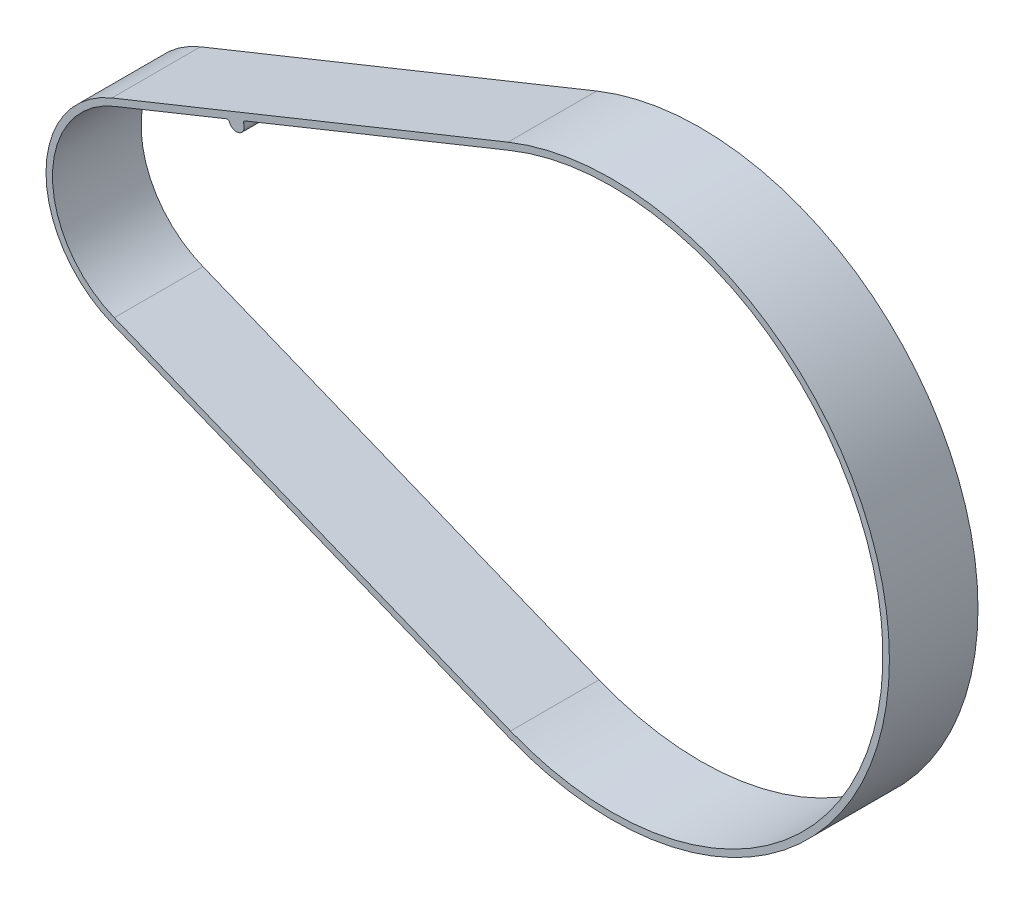
ISO-10303-21;
HEADER;
FILE_DESCRIPTION(('STEP AP214'),'2;1');
FILE_NAME('part.step','',(''),(''),'','','');
FILE_SCHEMA(('AUTOMOTIVE_DESIGN { 1 0 10303 214 1 1 1 1 }'));
ENDSEC;
DATA;
#1=APPLICATION_CONTEXT('core data for automotive mechanical design processes');
#2=APPLICATION_PROTOCOL_DEFINITION('international standard','automotive_design',2000,#1);
#3=PRODUCT_CONTEXT('',#1,'mechanical');
#4=PRODUCT('Part','Part','',(#3));
#5=PRODUCT_RELATED_PRODUCT_CATEGORY('part','',(#4));
#6=PRODUCT_DEFINITION_FORMATION('','',#4);
#7=PRODUCT_DEFINITION_CONTEXT('part definition',#1,'design');
#8=PRODUCT_DEFINITION('design','',#6,#7);
#9=PRODUCT_DEFINITION_SHAPE('','',#8);
#10=(LENGTH_UNIT() NAMED_UNIT(*) SI_UNIT(.MILLI.,.METRE.));
#11=(NAMED_UNIT(*) PLANE_ANGLE_UNIT() SI_UNIT($,.RADIAN.));
#12=(NAMED_UNIT(*) SI_UNIT($,.STERADIAN.) SOLID_ANGLE_UNIT());
#13=UNCERTAINTY_MEASURE_WITH_UNIT(LENGTH_MEASURE(1.E-05),#10,'distance_accuracy_value','');
#14=(GEOMETRIC_REPRESENTATION_CONTEXT(3) GLOBAL_UNCERTAINTY_ASSIGNED_CONTEXT((#13)) GLOBAL_UNIT_ASSIGNED_CONTEXT((#10,
#11,#12)) REPRESENTATION_CONTEXT('',''));
#15=CARTESIAN_POINT('',(0.,0.,0.));
#16=DIRECTION('',(0.,0.,1.));
#17=DIRECTION('',(1.,0.,0.));
#18=AXIS2_PLACEMENT_3D('',#15,#16,#17);
#19=CARTESIAN_POINT('',(-12.5059702381417,31.0012171742421,15.));
#20=DIRECTION('',(-0.374109321887665,0.927384610222076,0.));
#21=DIRECTION('',(-0.927384610222076,-0.374109321887665,0.));
#22=AXIS2_PLACEMENT_3D('',#19,#20,#21);
#23=PLANE('',#22);
#24=DIRECTION('',(0.927384610222076,0.374109321887665,0.));
#25=VECTOR('',#24,1.);
#26=CARTESIAN_POINT('',(-12.5059702381417,31.0012171742421,-15.));
#27=LINE('',#26,#25);
#28=CARTESIAN_POINT('',(-12.5059702381417,31.0012171742421,-15.));
#29=VERTEX_POINT('',#28);
#30=CARTESIAN_POINT('',(25.4411738449035,46.3091920791546,-15.));
#31=VERTEX_POINT('',#30);
#32=EDGE_CURVE('E182',#29,#31,#27,.T.);
#33=ORIENTED_EDGE('',*,*,#32,.T.);
#34=DIRECTION('',(0.,0.,1.));
#35=VECTOR('',#34,1.);
#36=CARTESIAN_POINT('',(25.4411738449035,46.3091920791546,15.));
#37=LINE('',#36,#35);
#38=CARTESIAN_POINT('',(25.4411738449035,46.3091920791546,15.));
#39=VERTEX_POINT('',#38);
#40=EDGE_CURVE('E60',#31,#39,#37,.T.);
#41=ORIENTED_EDGE('',*,*,#40,.T.);
#42=DIRECTION('',(0.927384610222076,0.374109321887665,0.));
#43=VECTOR('',#42,1.);
#44=CARTESIAN_POINT('',(-12.5059702381417,31.0012171742421,15.));
#45=LINE('',#44,#43);
#46=CARTESIAN_POINT('',(-12.5059702381417,31.0012171742421,15.));
#47=VERTEX_POINT('',#46);
#48=EDGE_CURVE('E160',#47,#39,#45,.T.);
#49=ORIENTED_EDGE('',*,*,#48,.F.);
#50=DIRECTION('',(0.,0.,-1.));
#51=VECTOR('',#50,1.);
#52=CARTESIAN_POINT('',(-12.5059702381417,31.0012171742421,15.));
#53=LINE('',#52,#51);
#54=EDGE_CURVE('E206',#47,#29,#53,.T.);
#55=ORIENTED_EDGE('',*,*,#54,.T.);
#56=EDGE_LOOP('',(#33,#41,#49,#55));
#57=FACE_BOUND('',#56,.T.);
#58=ADVANCED_FACE('F39',(#57),#23,.F.);
#59=CARTESIAN_POINT('',(31.7473891944136,48.8531354679907,15.));
#60=VERTEX_POINT('',#59);
#61=CARTESIAN_POINT('',(121.660615345031,85.1243606890831,15.));
#62=VERTEX_POINT('',#61);
#63=EDGE_CURVE('E150',#60,#62,#45,.T.);
#64=ORIENTED_EDGE('',*,*,#63,.F.);
#65=DIRECTION('',(0.,0.,1.));
#66=VECTOR('',#65,1.);
#67=CARTESIAN_POINT('',(31.7473891944136,48.8531354679907,-15.));
#68=LINE('',#67,#66);
#69=CARTESIAN_POINT('',(31.7473891944136,48.8531354679907,-15.));
#70=VERTEX_POINT('',#69);
#71=EDGE_CURVE('E204',#60,#70,#68,.F.);
#72=ORIENTED_EDGE('',*,*,#71,.T.);
#73=CARTESIAN_POINT('',(121.660615345031,85.1243606890831,-15.));
#74=VERTEX_POINT('',#73);
#75=EDGE_CURVE('E181',#70,#74,#27,.T.);
#76=ORIENTED_EDGE('',*,*,#75,.T.);
#77=DIRECTION('',(0.,0.,-1.));
#78=VECTOR('',#77,1.);
#79=CARTESIAN_POINT('',(121.660615345031,85.1243606890831,15.));
#80=LINE('',#79,#78);
#81=EDGE_CURVE('E173',#62,#74,#80,.T.);
#82=ORIENTED_EDGE('',*,*,#81,.F.);
#83=EDGE_LOOP('',(#64,#72,#76,#82));
#84=FACE_BOUND('',#83,.T.);
#85=ADVANCED_FACE('F227',(#84),#23,.F.);
#86=CARTESIAN_POINT('',(-13.3290107462946,33.0414633167307,15.));
#87=DIRECTION('',(-0.374109321887665,0.927384610222076,0.));
#88=DIRECTION('',(-0.927384610222076,-0.374109321887665,0.));
#89=AXIS2_PLACEMENT_3D('',#86,#87,#88);
#90=PLANE('',#89);
#91=DIRECTION('',(0.927384610222076,0.374109321887665,0.));
#92=VECTOR('',#91,1.);
#93=CARTESIAN_POINT('',(-13.3290107462946,33.0414633167307,-15.));
#94=LINE('',#93,#92);
#95=CARTESIAN_POINT('',(-13.3290107462946,33.0414633167307,-15.));
#96=VERTEX_POINT('',#95);
#97=CARTESIAN_POINT('',(120.837574836879,87.1646068315717,-15.));
#98=VERTEX_POINT('',#97);
#99=EDGE_CURVE('E184',#96,#98,#94,.T.);
#100=ORIENTED_EDGE('',*,*,#99,.F.);
#101=DIRECTION('',(0.,0.,-1.));
#102=VECTOR('',#101,1.);
#103=CARTESIAN_POINT('',(-13.3290107462946,33.0414633167307,15.));
#104=LINE('',#103,#102);
#105=CARTESIAN_POINT('',(-13.3290107462946,33.0414633167307,15.));
#106=VERTEX_POINT('',#105);
#107=EDGE_CURVE('E202',#106,#96,#104,.T.);
#108=ORIENTED_EDGE('',*,*,#107,.F.);
#109=DIRECTION('',(0.927384610222076,0.374109321887665,0.));
#110=VECTOR('',#109,1.);
#111=CARTESIAN_POINT('',(-13.3290107462946,33.0414633167307,15.));
#112=LINE('',#111,#110);
#113=CARTESIAN_POINT('',(120.837574836879,87.1646068315717,15.));
#114=VERTEX_POINT('',#113);
#115=EDGE_CURVE('E162',#106,#114,#112,.T.);
#116=ORIENTED_EDGE('',*,*,#115,.T.);
#117=DIRECTION('',(0.,0.,-1.));
#118=VECTOR('',#117,1.);
#119=CARTESIAN_POINT('',(120.837574836879,87.1646068315717,15.));
#120=LINE('',#119,#118);
#121=EDGE_CURVE('E139',#114,#98,#120,.T.);
#122=ORIENTED_EDGE('',*,*,#121,.T.);
#123=EDGE_LOOP('',(#100,#108,#116,#122));
#124=FACE_BOUND('',#123,.T.);
#125=ADVANCED_FACE('F258',(#124),#90,.T.);
#126=CARTESIAN_POINT('',(0.,0.,15.));
#127=DIRECTION('',(0.,0.,-1.));
#128=DIRECTION('',(-1.,0.,0.));
#129=AXIS2_PLACEMENT_3D('',#126,#127,#128);
#130=CYLINDRICAL_SURFACE('',#129,35.628651750883);
#131=CARTESIAN_POINT('',(0.,0.,-15.));
#132=DIRECTION('',(0.,0.,1.));
#133=DIRECTION('',(1.,0.,0.));
#134=AXIS2_PLACEMENT_3D('',#131,#132,#133);
#135=CIRCLE('',#134,35.628651750883);
#136=CARTESIAN_POINT('',(-13.3290107462946,-33.0414633167307,-15.));
#137=VERTEX_POINT('',#136);
#138=EDGE_CURVE('E187',#96,#137,#135,.T.);
#139=ORIENTED_EDGE('',*,*,#138,.T.);
#140=DIRECTION('',(0.,0.,-1.));
#141=VECTOR('',#140,1.);
#142=CARTESIAN_POINT('',(-13.3290107462946,-33.0414633167307,15.));
#143=LINE('',#142,#141);
#144=CARTESIAN_POINT('',(-13.3290107462946,-33.0414633167307,15.));
#145=VERTEX_POINT('',#144);
#146=EDGE_CURVE('E199',#145,#137,#143,.T.);
#147=ORIENTED_EDGE('',*,*,#146,.F.);
#148=CARTESIAN_POINT('',(0.,0.,15.));
#149=DIRECTION('',(0.,0.,1.));
#150=DIRECTION('',(1.,0.,0.));
#151=AXIS2_PLACEMENT_3D('',#148,#149,#150);
#152=CIRCLE('',#151,35.628651750883);
#153=EDGE_CURVE('E165',#106,#145,#152,.T.);
#154=ORIENTED_EDGE('',*,*,#153,.F.);
#155=ORIENTED_EDGE('',*,*,#107,.T.);
#156=EDGE_LOOP('',(#139,#147,#154,#155));
#157=FACE_BOUND('',#156,.T.);
#158=ADVANCED_FACE('F262',(#157),#130,.T.);
#159=CARTESIAN_POINT('',(-13.3290107462946,-33.0414633167307,15.));
#160=DIRECTION('',(0.374109321887665,0.927384610222076,0.));
#161=DIRECTION('',(-0.927384610222076,0.374109321887665,0.));
#162=AXIS2_PLACEMENT_3D('',#159,#160,#161);
#163=PLANE('',#162);
#164=DIRECTION('',(0.927384610222076,-0.374109321887665,0.));
#165=VECTOR('',#164,1.);
#166=CARTESIAN_POINT('',(-13.3290107462946,-33.0414633167307,-15.));
#167=LINE('',#166,#165);
#168=CARTESIAN_POINT('',(120.837574836879,-87.1646068315717,-15.));
#169=VERTEX_POINT('',#168);
#170=EDGE_CURVE('E190',#137,#169,#167,.T.);
#171=ORIENTED_EDGE('',*,*,#170,.T.);
#172=DIRECTION('',(0.,0.,-1.));
#173=VECTOR('',#172,1.);
#174=CARTESIAN_POINT('',(120.837574836879,-87.1646068315717,15.));
#175=LINE('',#174,#173);
#176=CARTESIAN_POINT('',(120.837574836879,-87.1646068315717,15.));
#177=VERTEX_POINT('',#176);
#178=EDGE_CURVE('E196',#177,#169,#175,.T.);
#179=ORIENTED_EDGE('',*,*,#178,.F.);
#180=DIRECTION('',(0.927384610222076,-0.374109321887665,0.));
#181=VECTOR('',#180,1.);
#182=CARTESIAN_POINT('',(-13.3290107462946,-33.0414633167307,15.));
#183=LINE('',#182,#181);
#184=EDGE_CURVE('E168',#145,#177,#183,.T.);
#185=ORIENTED_EDGE('',*,*,#184,.F.);
#186=ORIENTED_EDGE('',*,*,#146,.T.);
#187=EDGE_LOOP('',(#171,#179,#185,#186));
#188=FACE_BOUND('',#187,.T.);
#189=ADVANCED_FACE('F266',(#188),#163,.F.);
#190=CARTESIAN_POINT('',(156.,0.,15.));
#191=DIRECTION('',(0.,0.,-1.));
#192=DIRECTION('',(-1.,0.,0.));
#193=AXIS2_PLACEMENT_3D('',#190,#191,#192);
#194=CYLINDRICAL_SURFACE('',#193,91.7897059653587);
#195=CARTESIAN_POINT('',(156.,0.,-15.));
#196=DIRECTION('',(0.,0.,1.));
#197=DIRECTION('',(1.,0.,0.));
#198=AXIS2_PLACEMENT_3D('',#195,#196,#197);
#199=CIRCLE('',#198,91.7897059653587);
#200=CARTESIAN_POINT('',(121.660615345031,-85.1243606890832,-15.));
#201=VERTEX_POINT('',#200);
#202=EDGE_CURVE('E134',#201,#74,#199,.T.);
#203=ORIENTED_EDGE('',*,*,#202,.F.);
#204=DIRECTION('',(0.,0.,-1.));
#205=VECTOR('',#204,1.);
#206=CARTESIAN_POINT('',(121.660615345031,-85.1243606890832,15.));
#207=LINE('',#206,#205);
#208=CARTESIAN_POINT('',(121.660615345031,-85.1243606890832,15.));
#209=VERTEX_POINT('',#208);
#210=EDGE_CURVE('E128',#209,#201,#207,.T.);
#211=ORIENTED_EDGE('',*,*,#210,.F.);
#212=CARTESIAN_POINT('',(156.,0.,15.));
#213=DIRECTION('',(0.,0.,1.));
#214=DIRECTION('',(1.,0.,0.));
#215=AXIS2_PLACEMENT_3D('',#212,#213,#214);
#216=CIRCLE('',#215,91.7897059653587);
#217=EDGE_CURVE('E132',#209,#62,#216,.T.);
#218=ORIENTED_EDGE('',*,*,#217,.T.);
#219=ORIENTED_EDGE('',*,*,#81,.T.);
#220=EDGE_LOOP('',(#203,#211,#218,#219));
#221=FACE_BOUND('',#220,.T.);
#222=ADVANCED_FACE('F130',(#221),#194,.F.);
#223=CARTESIAN_POINT('',(-12.5059702381417,-31.0012171742421,15.));
#224=DIRECTION('',(0.374109321887665,0.927384610222076,0.));
#225=DIRECTION('',(-0.927384610222076,0.374109321887665,0.));
#226=AXIS2_PLACEMENT_3D('',#223,#224,#225);
#227=PLANE('',#226);
#228=DIRECTION('',(0.927384610222076,-0.374109321887665,0.));
#229=VECTOR('',#228,1.);
#230=CARTESIAN_POINT('',(-12.5059702381417,-31.0012171742421,-15.));
#231=LINE('',#230,#229);
#232=CARTESIAN_POINT('',(-12.5059702381417,-31.0012171742421,-15.));
#233=VERTEX_POINT('',#232);
#234=EDGE_CURVE('E175',#233,#201,#231,.T.);
#235=ORIENTED_EDGE('',*,*,#234,.F.);
#236=DIRECTION('',(0.,0.,-1.));
#237=VECTOR('',#236,1.);
#238=CARTESIAN_POINT('',(-12.5059702381417,-31.0012171742421,15.));
#239=LINE('',#238,#237);
#240=CARTESIAN_POINT('',(-12.5059702381417,-31.0012171742421,15.));
#241=VERTEX_POINT('',#240);
#242=EDGE_CURVE('E140',#241,#233,#239,.T.);
#243=ORIENTED_EDGE('',*,*,#242,.F.);
#244=DIRECTION('',(0.927384610222076,-0.374109321887665,0.));
#245=VECTOR('',#244,1.);
#246=CARTESIAN_POINT('',(-12.5059702381417,-31.0012171742421,15.));
#247=LINE('',#246,#245);
#248=EDGE_CURVE('E147',#241,#209,#247,.T.);
#249=ORIENTED_EDGE('',*,*,#248,.T.);
#250=ORIENTED_EDGE('',*,*,#210,.T.);
#251=EDGE_LOOP('',(#235,#243,#249,#250));
#252=FACE_BOUND('',#251,.T.);
#253=ADVANCED_FACE('F154',(#252),#227,.T.);
#254=CARTESIAN_POINT('',(0.,0.,15.));
#255=DIRECTION('',(0.,0.,-1.));
#256=DIRECTION('',(-1.,0.,0.));
#257=AXIS2_PLACEMENT_3D('',#254,#255,#256);
#258=CYLINDRICAL_SURFACE('',#257,33.428651750883);
#259=CARTESIAN_POINT('',(0.,0.,-15.));
#260=DIRECTION('',(0.,0.,1.));
#261=DIRECTION('',(1.,0.,0.));
#262=AXIS2_PLACEMENT_3D('',#259,#260,#261);
#263=CIRCLE('',#262,33.428651750883);
#264=EDGE_CURVE('E178',#29,#233,#263,.T.);
#265=ORIENTED_EDGE('',*,*,#264,.F.);
#266=ORIENTED_EDGE('',*,*,#54,.F.);
#267=CARTESIAN_POINT('',(0.,0.,15.));
#268=DIRECTION('',(0.,0.,1.));
#269=DIRECTION('',(1.,0.,0.));
#270=AXIS2_PLACEMENT_3D('',#267,#268,#269);
#271=CIRCLE('',#270,33.428651750883);
#272=EDGE_CURVE('E155',#47,#241,#271,.T.);
#273=ORIENTED_EDGE('',*,*,#272,.T.);
#274=ORIENTED_EDGE('',*,*,#242,.T.);
#275=EDGE_LOOP('',(#265,#266,#273,#274));
#276=FACE_BOUND('',#275,.T.);
#277=ADVANCED_FACE('F242',(#276),#258,.F.);
#278=CARTESIAN_POINT('',(156.,0.,15.));
#279=DIRECTION('',(0.,0.,-1.));
#280=DIRECTION('',(-1.,0.,0.));
#281=AXIS2_PLACEMENT_3D('',#278,#279,#280);
#282=CYLINDRICAL_SURFACE('',#281,93.9897059653587);
#283=CARTESIAN_POINT('',(156.,0.,-15.));
#284=DIRECTION('',(0.,0.,1.));
#285=DIRECTION('',(1.,0.,0.));
#286=AXIS2_PLACEMENT_3D('',#283,#284,#285);
#287=CIRCLE('',#286,93.9897059653587);
#288=EDGE_CURVE('E152',#169,#98,#287,.T.);
#289=ORIENTED_EDGE('',*,*,#288,.T.);
#290=ORIENTED_EDGE('',*,*,#121,.F.);
#291=CARTESIAN_POINT('',(156.,0.,15.));
#292=DIRECTION('',(0.,0.,1.));
#293=DIRECTION('',(1.,0.,0.));
#294=AXIS2_PLACEMENT_3D('',#291,#292,#293);
#295=CIRCLE('',#294,93.9897059653587);
#296=EDGE_CURVE('E171',#177,#114,#295,.T.);
#297=ORIENTED_EDGE('',*,*,#296,.F.);
#298=ORIENTED_EDGE('',*,*,#178,.T.);
#299=EDGE_LOOP('',(#289,#290,#297,#298));
#300=FACE_BOUND('',#299,.T.);
#301=ADVANCED_FACE('F244',(#300),#282,.T.);
#302=CARTESIAN_POINT('',(0.,0.,15.));
#303=DIRECTION('',(0.,0.,1.));
#304=DIRECTION('',(1.,0.,0.));
#305=AXIS2_PLACEMENT_3D('',#302,#303,#304);
#306=PLANE('',#305);
#307=ORIENTED_EDGE('',*,*,#217,.F.);
#308=ORIENTED_EDGE('',*,*,#248,.F.);
#309=ORIENTED_EDGE('',*,*,#272,.F.);
#310=ORIENTED_EDGE('',*,*,#48,.T.);
#311=CARTESIAN_POINT('',(25.7404613024136,45.5672843909769,15.));
#312=DIRECTION('',(0.,0.,1.));
#313=DIRECTION('',(1.,0.,0.));
#314=AXIS2_PLACEMENT_3D('',#311,#312,#313);
#315=CIRCLE('',#314,0.8);
#316=CARTESIAN_POINT('',(26.4823689905913,45.866571848487,15.));
#317=VERTEX_POINT('',#316);
#318=EDGE_CURVE('E11',#39,#317,#315,.F.);
#319=ORIENTED_EDGE('',*,*,#318,.T.);
#320=CARTESIAN_POINT('',(28.8935689771686,46.839256085395,15.));
#321=DIRECTION('',(0.,0.,1.));
#322=DIRECTION('',(1.,0.,0.));
#323=AXIS2_PLACEMENT_3D('',#320,#321,#322);
#324=CIRCLE('',#323,2.6);
#325=CARTESIAN_POINT('',(31.304768963746,47.8119403223029,15.));
#326=VERTEX_POINT('',#325);
#327=EDGE_CURVE('E176',#317,#326,#324,.T.);
#328=ORIENTED_EDGE('',*,*,#327,.T.);
#329=CARTESIAN_POINT('',(32.0466766519237,48.111227779813,15.));
#330=DIRECTION('',(0.,0.,1.));
#331=DIRECTION('',(1.,0.,0.));
#332=AXIS2_PLACEMENT_3D('',#329,#330,#331);
#333=CIRCLE('',#332,0.8);
#334=EDGE_CURVE('E219',#326,#60,#333,.F.);
#335=ORIENTED_EDGE('',*,*,#334,.T.);
#336=ORIENTED_EDGE('',*,*,#63,.T.);
#337=EDGE_LOOP('',(#307,#308,#309,#310,#319,#328,#335,#336));
#338=FACE_BOUND('',#337,.T.);
#339=ORIENTED_EDGE('',*,*,#115,.F.);
#340=ORIENTED_EDGE('',*,*,#153,.T.);
#341=ORIENTED_EDGE('',*,*,#184,.T.);
#342=ORIENTED_EDGE('',*,*,#296,.T.);
#343=EDGE_LOOP('',(#339,#340,#341,#342));
#344=FACE_BOUND('',#343,.T.);
#345=ADVANCED_FACE('F144',(#338,#344),#306,.T.);
#346=CARTESIAN_POINT('',(0.,0.,-15.));
#347=DIRECTION('',(0.,0.,1.));
#348=DIRECTION('',(1.,0.,0.));
#349=AXIS2_PLACEMENT_3D('',#346,#347,#348);
#350=PLANE('',#349);
#351=ORIENTED_EDGE('',*,*,#202,.T.);
#352=ORIENTED_EDGE('',*,*,#75,.F.);
#353=CARTESIAN_POINT('',(32.0466766519237,48.111227779813,-15.));
#354=DIRECTION('',(0.,0.,1.));
#355=DIRECTION('',(1.,0.,0.));
#356=AXIS2_PLACEMENT_3D('',#353,#354,#355);
#357=CIRCLE('',#356,0.8);
#358=CARTESIAN_POINT('',(31.304768963746,47.8119403223029,-15.));
#359=VERTEX_POINT('',#358);
#360=EDGE_CURVE('E217',#70,#359,#357,.T.);
#361=ORIENTED_EDGE('',*,*,#360,.T.);
#362=CARTESIAN_POINT('',(28.8935689771686,46.839256085395,-15.));
#363=DIRECTION('',(0.,0.,1.));
#364=DIRECTION('',(1.,0.,0.));
#365=AXIS2_PLACEMENT_3D('',#362,#363,#364);
#366=CIRCLE('',#365,2.6);
#367=CARTESIAN_POINT('',(26.4823689905913,45.866571848487,-15.));
#368=VERTEX_POINT('',#367);
#369=EDGE_CURVE('E233',#368,#359,#366,.T.);
#370=ORIENTED_EDGE('',*,*,#369,.F.);
#371=CARTESIAN_POINT('',(25.7404613024136,45.5672843909769,-15.));
#372=DIRECTION('',(0.,0.,1.));
#373=DIRECTION('',(1.,0.,0.));
#374=AXIS2_PLACEMENT_3D('',#371,#372,#373);
#375=CIRCLE('',#374,0.8);
#376=EDGE_CURVE('E47',#368,#31,#375,.T.);
#377=ORIENTED_EDGE('',*,*,#376,.T.);
#378=ORIENTED_EDGE('',*,*,#32,.F.);
#379=ORIENTED_EDGE('',*,*,#264,.T.);
#380=ORIENTED_EDGE('',*,*,#234,.T.);
#381=EDGE_LOOP('',(#351,#352,#361,#370,#377,#378,#379,#380));
#382=FACE_BOUND('',#381,.T.);
#383=ORIENTED_EDGE('',*,*,#99,.T.);
#384=ORIENTED_EDGE('',*,*,#288,.F.);
#385=ORIENTED_EDGE('',*,*,#170,.F.);
#386=ORIENTED_EDGE('',*,*,#138,.F.);
#387=EDGE_LOOP('',(#383,#384,#385,#386));
#388=FACE_BOUND('',#387,.T.);
#389=ADVANCED_FACE('F231',(#382,#388),#350,.F.);
#390=CARTESIAN_POINT('',(28.8935689771686,46.839256085395,15.));
#391=DIRECTION('',(0.,0.,-1.));
#392=DIRECTION('',(-1.,0.,0.));
#393=AXIS2_PLACEMENT_3D('',#390,#391,#392);
#394=CYLINDRICAL_SURFACE('',#393,2.6);
#395=ORIENTED_EDGE('',*,*,#369,.T.);
#396=DIRECTION('',(0.,0.,-1.));
#397=VECTOR('',#396,1.);
#398=CARTESIAN_POINT('',(31.304768963746,47.8119403223029,15.));
#399=LINE('',#398,#397);
#400=EDGE_CURVE('E214',#359,#326,#399,.F.);
#401=ORIENTED_EDGE('',*,*,#400,.T.);
#402=ORIENTED_EDGE('',*,*,#327,.F.);
#403=DIRECTION('',(0.,0.,-1.));
#404=VECTOR('',#403,1.);
#405=CARTESIAN_POINT('',(26.4823689905913,45.866571848487,15.));
#406=LINE('',#405,#404);
#407=EDGE_CURVE('E211',#317,#368,#406,.T.);
#408=ORIENTED_EDGE('',*,*,#407,.T.);
#409=EDGE_LOOP('',(#395,#401,#402,#408));
#410=FACE_BOUND('',#409,.T.);
#411=ADVANCED_FACE('F235',(#410),#394,.T.);
#412=CARTESIAN_POINT('',(32.0466766519237,48.111227779813,15.));
#413=DIRECTION('',(0.,0.,-1.));
#414=DIRECTION('',(-1.,0.,0.));
#415=AXIS2_PLACEMENT_3D('',#412,#413,#414);
#416=CYLINDRICAL_SURFACE('',#415,0.8);
#417=ORIENTED_EDGE('',*,*,#334,.F.);
#418=ORIENTED_EDGE('',*,*,#400,.F.);
#419=ORIENTED_EDGE('',*,*,#360,.F.);
#420=ORIENTED_EDGE('',*,*,#71,.F.);
#421=EDGE_LOOP('',(#417,#418,#419,#420));
#422=FACE_BOUND('',#421,.T.);
#423=ADVANCED_FACE('F229',(#422),#416,.F.);
#424=CARTESIAN_POINT('',(25.7404613024136,45.5672843909769,15.));
#425=DIRECTION('',(0.,0.,-1.));
#426=DIRECTION('',(-1.,0.,0.));
#427=AXIS2_PLACEMENT_3D('',#424,#425,#426);
#428=CYLINDRICAL_SURFACE('',#427,0.8);
#429=ORIENTED_EDGE('',*,*,#318,.F.);
#430=ORIENTED_EDGE('',*,*,#40,.F.);
#431=ORIENTED_EDGE('',*,*,#376,.F.);
#432=ORIENTED_EDGE('',*,*,#407,.F.);
#433=EDGE_LOOP('',(#429,#430,#431,#432));
#434=FACE_BOUND('',#433,.T.);
#435=ADVANCED_FACE('F41',(#434),#428,.F.);
#436=CLOSED_SHELL('',(#58,#85,#125,#158,#189,#222,#253,#277,#301,#345,#389,#411,#423,#435));
#437=MANIFOLD_SOLID_BREP('B2',#436);
#438=ADVANCED_BREP_SHAPE_REPRESENTATION('',(#18,#437),#14);
#439=SHAPE_DEFINITION_REPRESENTATION(#9,#438);
ENDSEC;
END-ISO-10303-21;
